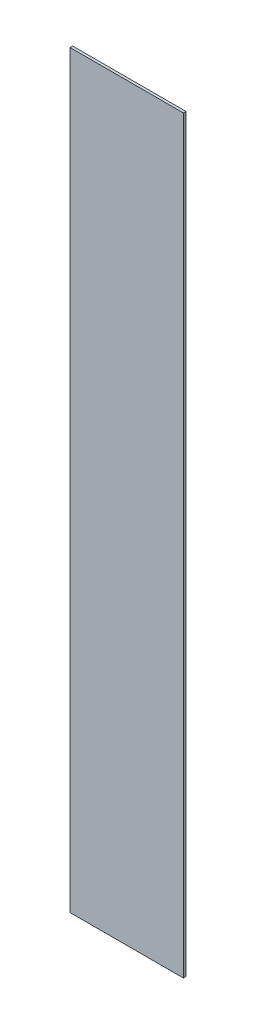
ISO-10303-21;
HEADER;
FILE_DESCRIPTION(('STEP AP214'),'2;1');
FILE_NAME('part.step','',(''),(''),'','','');
FILE_SCHEMA(('AUTOMOTIVE_DESIGN { 1 0 10303 214 1 1 1 1 }'));
ENDSEC;
DATA;
#1=APPLICATION_CONTEXT('core data for automotive mechanical design processes');
#2=APPLICATION_PROTOCOL_DEFINITION('international standard','automotive_design',2000,#1);
#3=PRODUCT_CONTEXT('',#1,'mechanical');
#4=PRODUCT('Part','Part','',(#3));
#5=PRODUCT_RELATED_PRODUCT_CATEGORY('part','',(#4));
#6=PRODUCT_DEFINITION_FORMATION('','',#4);
#7=PRODUCT_DEFINITION_CONTEXT('part definition',#1,'design');
#8=PRODUCT_DEFINITION('design','',#6,#7);
#9=PRODUCT_DEFINITION_SHAPE('','',#8);
#10=(LENGTH_UNIT() NAMED_UNIT(*) SI_UNIT(.MILLI.,.METRE.));
#11=(NAMED_UNIT(*) PLANE_ANGLE_UNIT() SI_UNIT($,.RADIAN.));
#12=(NAMED_UNIT(*) SI_UNIT($,.STERADIAN.) SOLID_ANGLE_UNIT());
#13=UNCERTAINTY_MEASURE_WITH_UNIT(LENGTH_MEASURE(1.E-05),#10,'distance_accuracy_value','');
#14=(GEOMETRIC_REPRESENTATION_CONTEXT(3) GLOBAL_UNCERTAINTY_ASSIGNED_CONTEXT((#13)) GLOBAL_UNIT_ASSIGNED_CONTEXT((#10,
#11,#12)) REPRESENTATION_CONTEXT('',''));
#15=CARTESIAN_POINT('',(0.,0.,0.));
#16=DIRECTION('',(0.,0.,1.));
#17=DIRECTION('',(1.,0.,0.));
#18=AXIS2_PLACEMENT_3D('',#15,#16,#17);
#19=CARTESIAN_POINT('',(0.,0.,1.5));
#20=DIRECTION('',(1.,0.,0.));
#21=DIRECTION('',(0.,0.,-1.));
#22=AXIS2_PLACEMENT_3D('',#19,#20,#21);
#23=PLANE('',#22);
#24=DIRECTION('',(0.,-1.,0.));
#25=VECTOR('',#24,1.);
#26=CARTESIAN_POINT('',(0.,0.,0.));
#27=LINE('',#26,#25);
#28=CARTESIAN_POINT('',(0.,430.,0.));
#29=VERTEX_POINT('',#28);
#30=CARTESIAN_POINT('',(0.,0.,0.));
#31=VERTEX_POINT('',#30);
#32=EDGE_CURVE('E97',#29,#31,#27,.T.);
#33=ORIENTED_EDGE('',*,*,#32,.T.);
#34=DIRECTION('',(0.,0.,-1.));
#35=VECTOR('',#34,1.);
#36=CARTESIAN_POINT('',(0.,0.,1.5));
#37=LINE('',#36,#35);
#38=CARTESIAN_POINT('',(0.,0.,1.5));
#39=VERTEX_POINT('',#38);
#40=EDGE_CURVE('E11',#39,#31,#37,.T.);
#41=ORIENTED_EDGE('',*,*,#40,.F.);
#42=DIRECTION('',(0.,-1.,0.));
#43=VECTOR('',#42,1.);
#44=CARTESIAN_POINT('',(0.,0.,1.5));
#45=LINE('',#44,#43);
#46=CARTESIAN_POINT('',(0.,430.,1.5));
#47=VERTEX_POINT('',#46);
#48=EDGE_CURVE('E85',#47,#39,#45,.T.);
#49=ORIENTED_EDGE('',*,*,#48,.F.);
#50=DIRECTION('',(0.,0.,-1.));
#51=VECTOR('',#50,1.);
#52=CARTESIAN_POINT('',(0.,430.,1.5));
#53=LINE('',#52,#51);
#54=EDGE_CURVE('E93',#47,#29,#53,.T.);
#55=ORIENTED_EDGE('',*,*,#54,.T.);
#56=EDGE_LOOP('',(#33,#41,#49,#55));
#57=FACE_BOUND('',#56,.T.);
#58=ADVANCED_FACE('F34',(#57),#23,.F.);
#59=CARTESIAN_POINT('',(0.,0.,1.5));
#60=DIRECTION('',(0.,1.,0.));
#61=DIRECTION('',(0.,0.,1.));
#62=AXIS2_PLACEMENT_3D('',#59,#60,#61);
#63=PLANE('',#62);
#64=DIRECTION('',(1.,0.,0.));
#65=VECTOR('',#64,1.);
#66=CARTESIAN_POINT('',(0.,0.,0.));
#67=LINE('',#66,#65);
#68=CARTESIAN_POINT('',(65.,0.,0.));
#69=VERTEX_POINT('',#68);
#70=EDGE_CURVE('E89',#31,#69,#67,.T.);
#71=ORIENTED_EDGE('',*,*,#70,.T.);
#72=DIRECTION('',(0.,0.,-1.));
#73=VECTOR('',#72,1.);
#74=CARTESIAN_POINT('',(65.,0.,1.5));
#75=LINE('',#74,#73);
#76=CARTESIAN_POINT('',(65.,0.,1.5));
#77=VERTEX_POINT('',#76);
#78=EDGE_CURVE('E42',#77,#69,#75,.T.);
#79=ORIENTED_EDGE('',*,*,#78,.F.);
#80=DIRECTION('',(1.,0.,0.));
#81=VECTOR('',#80,1.);
#82=CARTESIAN_POINT('',(0.,0.,1.5));
#83=LINE('',#82,#81);
#84=EDGE_CURVE('E80',#39,#77,#83,.T.);
#85=ORIENTED_EDGE('',*,*,#84,.F.);
#86=ORIENTED_EDGE('',*,*,#40,.T.);
#87=EDGE_LOOP('',(#71,#79,#85,#86));
#88=FACE_BOUND('',#87,.T.);
#89=ADVANCED_FACE('F88',(#88),#63,.F.);
#90=CARTESIAN_POINT('',(65.,0.,1.5));
#91=DIRECTION('',(-1.,0.,0.));
#92=DIRECTION('',(0.,0.,1.));
#93=AXIS2_PLACEMENT_3D('',#90,#91,#92);
#94=PLANE('',#93);
#95=DIRECTION('',(0.,1.,0.));
#96=VECTOR('',#95,1.);
#97=CARTESIAN_POINT('',(65.,0.,0.));
#98=LINE('',#97,#96);
#99=CARTESIAN_POINT('',(65.,430.,0.));
#100=VERTEX_POINT('',#99);
#101=EDGE_CURVE('E67',#69,#100,#98,.T.);
#102=ORIENTED_EDGE('',*,*,#101,.T.);
#103=DIRECTION('',(0.,0.,-1.));
#104=VECTOR('',#103,1.);
#105=CARTESIAN_POINT('',(65.,430.,1.5));
#106=LINE('',#105,#104);
#107=CARTESIAN_POINT('',(65.,430.,1.5));
#108=VERTEX_POINT('',#107);
#109=EDGE_CURVE('E90',#108,#100,#106,.T.);
#110=ORIENTED_EDGE('',*,*,#109,.F.);
#111=DIRECTION('',(0.,1.,0.));
#112=VECTOR('',#111,1.);
#113=CARTESIAN_POINT('',(65.,0.,1.5));
#114=LINE('',#113,#112);
#115=EDGE_CURVE('E83',#77,#108,#114,.T.);
#116=ORIENTED_EDGE('',*,*,#115,.F.);
#117=ORIENTED_EDGE('',*,*,#78,.T.);
#118=EDGE_LOOP('',(#102,#110,#116,#117));
#119=FACE_BOUND('',#118,.T.);
#120=ADVANCED_FACE('F91',(#119),#94,.F.);
#121=CARTESIAN_POINT('',(0.,430.,1.5));
#122=DIRECTION('',(0.,-1.,0.));
#123=DIRECTION('',(0.,0.,-1.));
#124=AXIS2_PLACEMENT_3D('',#121,#122,#123);
#125=PLANE('',#124);
#126=DIRECTION('',(-1.,0.,0.));
#127=VECTOR('',#126,1.);
#128=CARTESIAN_POINT('',(0.,430.,0.));
#129=LINE('',#128,#127);
#130=EDGE_CURVE('E73',#100,#29,#129,.T.);
#131=ORIENTED_EDGE('',*,*,#130,.T.);
#132=ORIENTED_EDGE('',*,*,#54,.F.);
#133=DIRECTION('',(-1.,0.,0.));
#134=VECTOR('',#133,1.);
#135=CARTESIAN_POINT('',(0.,430.,1.5));
#136=LINE('',#135,#134);
#137=EDGE_CURVE('E50',#108,#47,#136,.T.);
#138=ORIENTED_EDGE('',*,*,#137,.F.);
#139=ORIENTED_EDGE('',*,*,#109,.T.);
#140=EDGE_LOOP('',(#131,#132,#138,#139));
#141=FACE_BOUND('',#140,.T.);
#142=ADVANCED_FACE('F104',(#141),#125,.F.);
#143=CARTESIAN_POINT('',(0.,0.,1.5));
#144=DIRECTION('',(0.,0.,-1.));
#145=DIRECTION('',(-1.,0.,0.));
#146=AXIS2_PLACEMENT_3D('',#143,#144,#145);
#147=PLANE('',#146);
#148=ORIENTED_EDGE('',*,*,#48,.T.);
#149=ORIENTED_EDGE('',*,*,#84,.T.);
#150=ORIENTED_EDGE('',*,*,#115,.T.);
#151=ORIENTED_EDGE('',*,*,#137,.T.);
#152=EDGE_LOOP('',(#148,#149,#150,#151));
#153=FACE_BOUND('',#152,.T.);
#154=ADVANCED_FACE('F81',(#153),#147,.F.);
#155=CARTESIAN_POINT('',(0.,0.,0.));
#156=DIRECTION('',(0.,0.,-1.));
#157=DIRECTION('',(-1.,0.,0.));
#158=AXIS2_PLACEMENT_3D('',#155,#156,#157);
#159=PLANE('',#158);
#160=ORIENTED_EDGE('',*,*,#32,.F.);
#161=ORIENTED_EDGE('',*,*,#130,.F.);
#162=ORIENTED_EDGE('',*,*,#101,.F.);
#163=ORIENTED_EDGE('',*,*,#70,.F.);
#164=EDGE_LOOP('',(#160,#161,#162,#163));
#165=FACE_BOUND('',#164,.T.);
#166=ADVANCED_FACE('F107',(#165),#159,.T.);
#167=CLOSED_SHELL('',(#58,#89,#120,#142,#154,#166));
#168=MANIFOLD_SOLID_BREP('B2',#167);
#169=ADVANCED_BREP_SHAPE_REPRESENTATION('',(#18,#168),#14);
#170=SHAPE_DEFINITION_REPRESENTATION(#9,#169);
ENDSEC;
END-ISO-10303-21;
